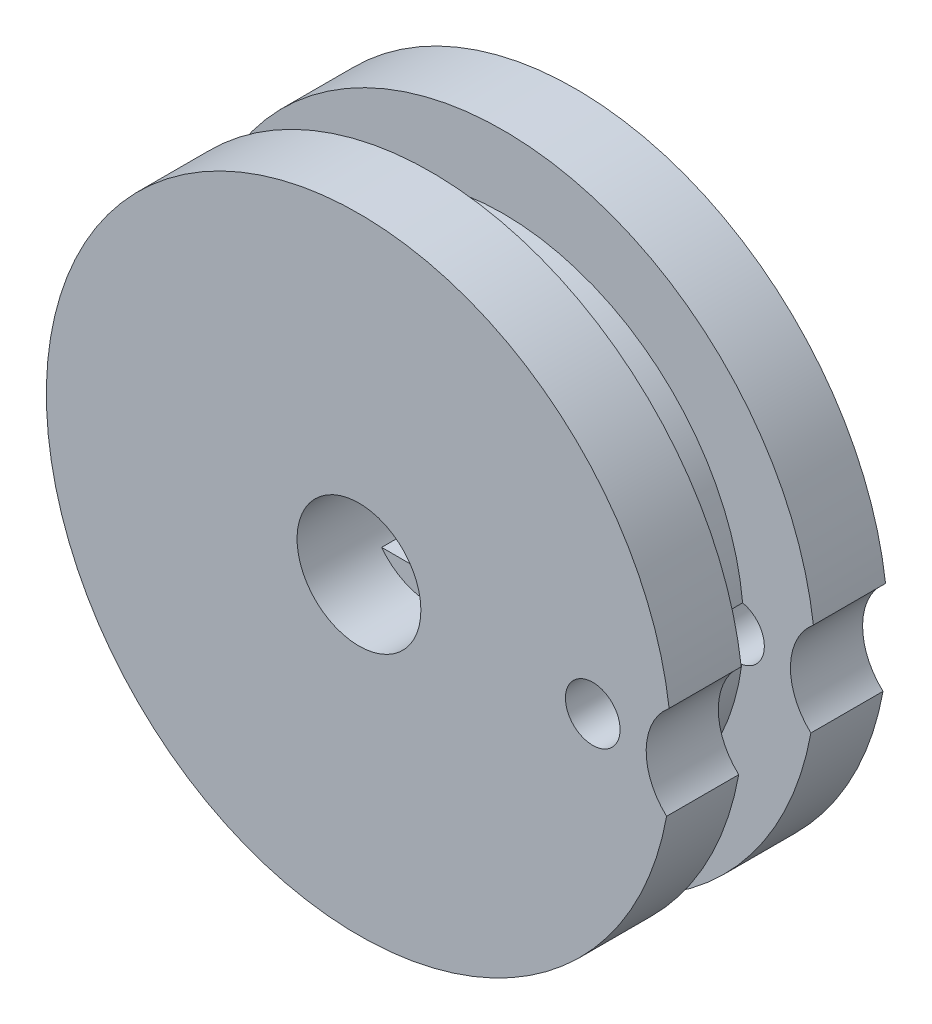
ISO-10303-21;
HEADER;
FILE_DESCRIPTION(('STEP AP214'),'2;1');
FILE_NAME('part.step','',(''),(''),'','','');
FILE_SCHEMA(('AUTOMOTIVE_DESIGN { 1 0 10303 214 1 1 1 1 }'));
ENDSEC;
DATA;
#1=APPLICATION_CONTEXT('core data for automotive mechanical design processes');
#2=APPLICATION_PROTOCOL_DEFINITION('international standard','automotive_design',2000,#1);
#3=PRODUCT_CONTEXT('',#1,'mechanical');
#4=PRODUCT('Part','Part','',(#3));
#5=PRODUCT_RELATED_PRODUCT_CATEGORY('part','',(#4));
#6=PRODUCT_DEFINITION_FORMATION('','',#4);
#7=PRODUCT_DEFINITION_CONTEXT('part definition',#1,'design');
#8=PRODUCT_DEFINITION('design','',#6,#7);
#9=PRODUCT_DEFINITION_SHAPE('','',#8);
#10=(LENGTH_UNIT() NAMED_UNIT(*) SI_UNIT(.MILLI.,.METRE.));
#11=(NAMED_UNIT(*) PLANE_ANGLE_UNIT() SI_UNIT($,.RADIAN.));
#12=(NAMED_UNIT(*) SI_UNIT($,.STERADIAN.) SOLID_ANGLE_UNIT());
#13=UNCERTAINTY_MEASURE_WITH_UNIT(LENGTH_MEASURE(1.E-05),#10,'distance_accuracy_value','');
#14=(GEOMETRIC_REPRESENTATION_CONTEXT(3) GLOBAL_UNCERTAINTY_ASSIGNED_CONTEXT((#13)) GLOBAL_UNIT_ASSIGNED_CONTEXT((#10,
#11,#12)) REPRESENTATION_CONTEXT('',''));
#15=CARTESIAN_POINT('',(0.,0.,0.));
#16=DIRECTION('',(0.,0.,1.));
#17=DIRECTION('',(1.,0.,0.));
#18=AXIS2_PLACEMENT_3D('',#15,#16,#17);
#19=CARTESIAN_POINT('',(0.,0.,0.));
#20=DIRECTION('',(0.,0.,1.));
#21=DIRECTION('',(1.,0.,0.));
#22=AXIS2_PLACEMENT_3D('',#19,#20,#21);
#23=PLANE('',#22);
#24=CARTESIAN_POINT('',(0.,0.,0.));
#25=DIRECTION('',(0.,0.,1.));
#26=DIRECTION('',(1.,0.,0.));
#27=AXIS2_PLACEMENT_3D('',#24,#25,#26);
#28=CIRCLE('',#27,13.);
#29=CARTESIAN_POINT('',(12.8976618667881,1.62797984324113,0.));
#30=VERTEX_POINT('',#29);
#31=CARTESIAN_POINT('',(12.7931561509895,-2.30979559623791,0.));
#32=VERTEX_POINT('',#31);
#33=EDGE_CURVE('E126',#30,#32,#28,.T.);
#34=ORIENTED_EDGE('',*,*,#33,.F.);
#35=CARTESIAN_POINT('',(14.5447372567907,-0.386006820725474,0.));
#36=DIRECTION('',(0.,0.,1.));
#37=DIRECTION('',(1.,0.,0.));
#38=AXIS2_PLACEMENT_3D('',#35,#36,#37);
#39=CIRCLE('',#38,2.60173012109007);
#40=EDGE_CURVE('E128',#30,#32,#39,.T.);
#41=ORIENTED_EDGE('',*,*,#40,.T.);
#42=EDGE_LOOP('',(#34,#41));
#43=FACE_BOUND('',#42,.T.);
#44=CARTESIAN_POINT('',(0.,0.,0.));
#45=DIRECTION('',(0.,0.,-1.));
#46=DIRECTION('',(-1.,0.,0.));
#47=AXIS2_PLACEMENT_3D('',#44,#45,#46);
#48=CIRCLE('',#47,10.);
#49=CARTESIAN_POINT('',(9.91846990033914,-1.27434486543731,0.));
#50=VERTEX_POINT('',#49);
#51=CARTESIAN_POINT('',(9.95411253835186,0.956892665781425,0.));
#52=VERTEX_POINT('',#51);
#53=EDGE_CURVE('E132',#50,#52,#48,.T.);
#54=ORIENTED_EDGE('',*,*,#53,.F.);
#55=CARTESIAN_POINT('',(9.72191381946582,-0.155301553604107,0.));
#56=DIRECTION('',(0.,0.,1.));
#57=DIRECTION('',(1.,0.,0.));
#58=AXIS2_PLACEMENT_3D('',#55,#56,#57);
#59=CIRCLE('',#58,1.13617438216451);
#60=EDGE_CURVE('E203',#50,#52,#59,.T.);
#61=ORIENTED_EDGE('',*,*,#60,.T.);
#62=EDGE_LOOP('',(#54,#61));
#63=FACE_BOUND('',#62,.T.);
#64=ADVANCED_FACE('F37',(#43,#63),#23,.F.);
#65=CARTESIAN_POINT('',(0.,0.,3.));
#66=DIRECTION('',(0.,0.,-1.));
#67=DIRECTION('',(-1.,0.,0.));
#68=AXIS2_PLACEMENT_3D('',#65,#66,#67);
#69=CYLINDRICAL_SURFACE('',#68,2.575);
#70=CARTESIAN_POINT('',(0.,0.,3.));
#71=DIRECTION('',(0.,0.,1.));
#72=DIRECTION('',(1.,0.,0.));
#73=AXIS2_PLACEMENT_3D('',#70,#71,#72);
#74=CIRCLE('',#73,2.575);
#75=CARTESIAN_POINT('',(2.575,0.,3.));
#76=VERTEX_POINT('',#75);
#77=EDGE_CURVE('E133',#76,#76,#74,.T.);
#78=ORIENTED_EDGE('',*,*,#77,.T.);
#79=EDGE_LOOP('',(#78));
#80=FACE_BOUND('',#79,.T.);
#81=CARTESIAN_POINT('',(0.,0.,0.));
#82=DIRECTION('',(0.,0.,1.));
#83=DIRECTION('',(1.,0.,0.));
#84=AXIS2_PLACEMENT_3D('',#81,#82,#83);
#85=CIRCLE('',#84,2.575);
#86=CARTESIAN_POINT('',(2.05624050149782,1.55,0.));
#87=VERTEX_POINT('',#86);
#88=CARTESIAN_POINT('',(-2.05624050149782,1.55,0.));
#89=VERTEX_POINT('',#88);
#90=EDGE_CURVE('E140',#87,#89,#85,.T.);
#91=ORIENTED_EDGE('',*,*,#90,.F.);
#92=DIRECTION('',(0.,0.,1.));
#93=VECTOR('',#92,1.);
#94=CARTESIAN_POINT('',(2.05624050149782,1.55,-3.));
#95=LINE('',#94,#93);
#96=CARTESIAN_POINT('',(2.05624050149782,1.55,-6.));
#97=VERTEX_POINT('',#96);
#98=EDGE_CURVE('E178',#97,#87,#95,.T.);
#99=ORIENTED_EDGE('',*,*,#98,.F.);
#100=CARTESIAN_POINT('',(0.,0.,-6.));
#101=DIRECTION('',(0.,0.,-1.));
#102=DIRECTION('',(-1.,0.,0.));
#103=AXIS2_PLACEMENT_3D('',#100,#101,#102);
#104=CIRCLE('',#103,2.575);
#105=CARTESIAN_POINT('',(2.05624050149782,-1.55,-6.));
#106=VERTEX_POINT('',#105);
#107=EDGE_CURVE('E164',#97,#106,#104,.T.);
#108=ORIENTED_EDGE('',*,*,#107,.T.);
#109=DIRECTION('',(0.,0.,1.));
#110=VECTOR('',#109,1.);
#111=CARTESIAN_POINT('',(2.05624050149782,-1.55,-3.));
#112=LINE('',#111,#110);
#113=CARTESIAN_POINT('',(2.05624050149782,-1.55,0.));
#114=VERTEX_POINT('',#113);
#115=EDGE_CURVE('E175',#106,#114,#112,.T.);
#116=ORIENTED_EDGE('',*,*,#115,.T.);
#117=CARTESIAN_POINT('',(-2.05624050149782,-1.55,0.));
#118=VERTEX_POINT('',#117);
#119=EDGE_CURVE('E142',#118,#114,#85,.T.);
#120=ORIENTED_EDGE('',*,*,#119,.F.);
#121=DIRECTION('',(0.,0.,1.));
#122=VECTOR('',#121,1.);
#123=CARTESIAN_POINT('',(-2.05624050149782,-1.55,-3.));
#124=LINE('',#123,#122);
#125=CARTESIAN_POINT('',(-2.05624050149782,-1.55,-6.));
#126=VERTEX_POINT('',#125);
#127=EDGE_CURVE('E172',#126,#118,#124,.T.);
#128=ORIENTED_EDGE('',*,*,#127,.F.);
#129=CARTESIAN_POINT('',(0.,0.,-6.));
#130=DIRECTION('',(0.,0.,-1.));
#131=DIRECTION('',(-1.,0.,0.));
#132=AXIS2_PLACEMENT_3D('',#129,#130,#131);
#133=CIRCLE('',#132,2.575);
#134=CARTESIAN_POINT('',(-2.05624050149782,1.55,-6.));
#135=VERTEX_POINT('',#134);
#136=EDGE_CURVE('E199',#126,#135,#133,.T.);
#137=ORIENTED_EDGE('',*,*,#136,.T.);
#138=DIRECTION('',(0.,0.,1.));
#139=VECTOR('',#138,1.);
#140=CARTESIAN_POINT('',(-2.05624050149782,1.55,-3.));
#141=LINE('',#140,#139);
#142=EDGE_CURVE('E181',#135,#89,#141,.T.);
#143=ORIENTED_EDGE('',*,*,#142,.T.);
#144=EDGE_LOOP('',(#91,#99,#108,#116,#120,#128,#137,#143));
#145=FACE_BOUND('',#144,.T.);
#146=ADVANCED_FACE('F39',(#80,#145),#69,.F.);
#147=CARTESIAN_POINT('',(0.,0.,3.));
#148=DIRECTION('',(0.,0.,-1.));
#149=DIRECTION('',(-1.,0.,0.));
#150=AXIS2_PLACEMENT_3D('',#147,#148,#149);
#151=CYLINDRICAL_SURFACE('',#150,13.);
#152=ORIENTED_EDGE('',*,*,#33,.T.);
#153=DIRECTION('',(0.,0.,1.));
#154=VECTOR('',#153,1.);
#155=CARTESIAN_POINT('',(12.7931561509895,-2.30979559623791,-4.));
#156=LINE('',#155,#154);
#157=CARTESIAN_POINT('',(12.7931561509895,-2.30979559623791,3.));
#158=VERTEX_POINT('',#157);
#159=EDGE_CURVE('E114',#32,#158,#156,.T.);
#160=ORIENTED_EDGE('',*,*,#159,.T.);
#161=CARTESIAN_POINT('',(0.,0.,3.));
#162=DIRECTION('',(0.,0.,1.));
#163=DIRECTION('',(1.,0.,0.));
#164=AXIS2_PLACEMENT_3D('',#161,#162,#163);
#165=CIRCLE('',#164,13.);
#166=CARTESIAN_POINT('',(12.8976618667881,1.62797984324113,3.));
#167=VERTEX_POINT('',#166);
#168=EDGE_CURVE('E124',#167,#158,#165,.T.);
#169=ORIENTED_EDGE('',*,*,#168,.F.);
#170=DIRECTION('',(0.,0.,1.));
#171=VECTOR('',#170,1.);
#172=CARTESIAN_POINT('',(12.8976618667881,1.62797984324113,-4.));
#173=LINE('',#172,#171);
#174=EDGE_CURVE('E52',#167,#30,#173,.F.);
#175=ORIENTED_EDGE('',*,*,#174,.T.);
#176=EDGE_LOOP('',(#152,#160,#169,#175));
#177=FACE_BOUND('',#176,.T.);
#178=ADVANCED_FACE('F123',(#177),#151,.T.);
#179=CARTESIAN_POINT('',(0.,0.,3.));
#180=DIRECTION('',(0.,0.,1.));
#181=DIRECTION('',(1.,0.,0.));
#182=AXIS2_PLACEMENT_3D('',#179,#180,#181);
#183=PLANE('',#182);
#184=CARTESIAN_POINT('',(14.5447372567907,-0.386006820725474,3.));
#185=DIRECTION('',(0.,0.,1.));
#186=DIRECTION('',(1.,0.,0.));
#187=AXIS2_PLACEMENT_3D('',#184,#185,#186);
#188=CIRCLE('',#187,2.60173012109007);
#189=EDGE_CURVE('E111',#167,#158,#188,.T.);
#190=ORIENTED_EDGE('',*,*,#189,.F.);
#191=ORIENTED_EDGE('',*,*,#168,.T.);
#192=EDGE_LOOP('',(#190,#191));
#193=FACE_BOUND('',#192,.T.);
#194=CARTESIAN_POINT('',(9.72191381946582,-0.155301553604107,3.));
#195=DIRECTION('',(0.,0.,1.));
#196=DIRECTION('',(1.,0.,0.));
#197=AXIS2_PLACEMENT_3D('',#194,#195,#196);
#198=CIRCLE('',#197,1.13617438216451);
#199=CARTESIAN_POINT('',(10.8580882016303,-0.155301553604107,3.));
#200=VERTEX_POINT('',#199);
#201=EDGE_CURVE('E127',#200,#200,#198,.T.);
#202=ORIENTED_EDGE('',*,*,#201,.F.);
#203=EDGE_LOOP('',(#202));
#204=FACE_BOUND('',#203,.T.);
#205=ORIENTED_EDGE('',*,*,#77,.F.);
#206=EDGE_LOOP('',(#205));
#207=FACE_BOUND('',#206,.T.);
#208=ADVANCED_FACE('F130',(#193,#204,#207),#183,.T.);
#209=CARTESIAN_POINT('',(0.,0.,0.));
#210=DIRECTION('',(0.,0.,-1.));
#211=DIRECTION('',(-1.,0.,0.));
#212=AXIS2_PLACEMENT_3D('',#209,#210,#211);
#213=PLANE('',#212);
#214=DIRECTION('',(1.,0.,0.));
#215=VECTOR('',#214,1.);
#216=CARTESIAN_POINT('',(-2.05624050149782,1.55,0.));
#217=LINE('',#216,#215);
#218=EDGE_CURVE('E161',#89,#87,#217,.T.);
#219=ORIENTED_EDGE('',*,*,#218,.T.);
#220=ORIENTED_EDGE('',*,*,#90,.T.);
#221=EDGE_LOOP('',(#219,#220));
#222=FACE_BOUND('',#221,.T.);
#223=ADVANCED_FACE('F255',(#222),#213,.F.);
#224=DIRECTION('',(-1.,0.,0.));
#225=VECTOR('',#224,1.);
#226=CARTESIAN_POINT('',(-2.05624050149782,-1.55,0.));
#227=LINE('',#226,#225);
#228=EDGE_CURVE('E169',#114,#118,#227,.T.);
#229=ORIENTED_EDGE('',*,*,#228,.T.);
#230=ORIENTED_EDGE('',*,*,#119,.T.);
#231=EDGE_LOOP('',(#229,#230));
#232=FACE_BOUND('',#231,.T.);
#233=ADVANCED_FACE('F189',(#232),#213,.F.);
#234=CARTESIAN_POINT('',(0.,0.,-3.));
#235=DIRECTION('',(0.,0.,1.));
#236=DIRECTION('',(1.,0.,0.));
#237=AXIS2_PLACEMENT_3D('',#234,#235,#236);
#238=CYLINDRICAL_SURFACE('',#237,10.);
#239=ORIENTED_EDGE('',*,*,#53,.T.);
#240=DIRECTION('',(0.,0.,1.));
#241=VECTOR('',#240,1.);
#242=CARTESIAN_POINT('',(9.95411253835186,0.956892665781425,-4.));
#243=LINE('',#242,#241);
#244=CARTESIAN_POINT('',(9.95411253835186,0.956892665781428,-3.));
#245=VERTEX_POINT('',#244);
#246=EDGE_CURVE('E213',#52,#245,#243,.F.);
#247=ORIENTED_EDGE('',*,*,#246,.T.);
#248=CARTESIAN_POINT('',(0.,0.,-3.));
#249=DIRECTION('',(0.,0.,-1.));
#250=DIRECTION('',(-1.,0.,0.));
#251=AXIS2_PLACEMENT_3D('',#248,#249,#250);
#252=CIRCLE('',#251,10.);
#253=CARTESIAN_POINT('',(9.91846990033914,-1.27434486543732,-3.));
#254=VERTEX_POINT('',#253);
#255=EDGE_CURVE('E184',#254,#245,#252,.T.);
#256=ORIENTED_EDGE('',*,*,#255,.F.);
#257=DIRECTION('',(0.,0.,1.));
#258=VECTOR('',#257,1.);
#259=CARTESIAN_POINT('',(9.91846990033914,-1.27434486543731,-4.));
#260=LINE('',#259,#258);
#261=EDGE_CURVE('E216',#254,#50,#260,.T.);
#262=ORIENTED_EDGE('',*,*,#261,.T.);
#263=EDGE_LOOP('',(#239,#247,#256,#262));
#264=FACE_BOUND('',#263,.T.);
#265=ADVANCED_FACE('F240',(#264),#238,.T.);
#266=CARTESIAN_POINT('',(-2.05624050149782,1.55,-3.));
#267=DIRECTION('',(0.,-1.,0.));
#268=DIRECTION('',(0.,0.,-1.));
#269=AXIS2_PLACEMENT_3D('',#266,#267,#268);
#270=PLANE('',#269);
#271=ORIENTED_EDGE('',*,*,#218,.F.);
#272=ORIENTED_EDGE('',*,*,#142,.F.);
#273=DIRECTION('',(1.,0.,0.));
#274=VECTOR('',#273,1.);
#275=CARTESIAN_POINT('',(-2.05624050149782,1.55,-6.));
#276=LINE('',#275,#274);
#277=EDGE_CURVE('E202',#135,#97,#276,.T.);
#278=ORIENTED_EDGE('',*,*,#277,.T.);
#279=ORIENTED_EDGE('',*,*,#98,.T.);
#280=EDGE_LOOP('',(#271,#272,#278,#279));
#281=FACE_BOUND('',#280,.T.);
#282=ADVANCED_FACE('F265',(#281),#270,.T.);
#283=CARTESIAN_POINT('',(-2.05624050149782,-1.55,-3.));
#284=DIRECTION('',(0.,1.,0.));
#285=DIRECTION('',(0.,0.,1.));
#286=AXIS2_PLACEMENT_3D('',#283,#284,#285);
#287=PLANE('',#286);
#288=ORIENTED_EDGE('',*,*,#228,.F.);
#289=ORIENTED_EDGE('',*,*,#115,.F.);
#290=DIRECTION('',(-1.,0.,0.));
#291=VECTOR('',#290,1.);
#292=CARTESIAN_POINT('',(-2.05624050149782,-1.55,-6.));
#293=LINE('',#292,#291);
#294=EDGE_CURVE('E159',#106,#126,#293,.T.);
#295=ORIENTED_EDGE('',*,*,#294,.T.);
#296=ORIENTED_EDGE('',*,*,#127,.T.);
#297=EDGE_LOOP('',(#288,#289,#295,#296));
#298=FACE_BOUND('',#297,.T.);
#299=ADVANCED_FACE('F196',(#298),#287,.T.);
#300=CARTESIAN_POINT('',(0.,0.,-3.));
#301=DIRECTION('',(0.,0.,-1.));
#302=DIRECTION('',(-1.,0.,0.));
#303=AXIS2_PLACEMENT_3D('',#300,#301,#302);
#304=PLANE('',#303);
#305=CARTESIAN_POINT('',(0.,0.,-3.));
#306=DIRECTION('',(0.,0.,-1.));
#307=DIRECTION('',(-1.,0.,0.));
#308=AXIS2_PLACEMENT_3D('',#305,#306,#307);
#309=CIRCLE('',#308,13.);
#310=CARTESIAN_POINT('',(12.7931561509895,-2.30979559623791,-3.));
#311=VERTEX_POINT('',#310);
#312=CARTESIAN_POINT('',(12.8976618667881,1.62797984324113,-3.));
#313=VERTEX_POINT('',#312);
#314=EDGE_CURVE('E152',#311,#313,#309,.T.);
#315=ORIENTED_EDGE('',*,*,#314,.F.);
#316=CARTESIAN_POINT('',(14.5447372567907,-0.386006820725474,-3.));
#317=DIRECTION('',(0.,0.,-1.));
#318=DIRECTION('',(-1.,0.,0.));
#319=AXIS2_PLACEMENT_3D('',#316,#317,#318);
#320=CIRCLE('',#319,2.60173012109007);
#321=EDGE_CURVE('E60',#311,#313,#320,.T.);
#322=ORIENTED_EDGE('',*,*,#321,.T.);
#323=EDGE_LOOP('',(#315,#322));
#324=FACE_BOUND('',#323,.T.);
#325=ORIENTED_EDGE('',*,*,#255,.T.);
#326=CARTESIAN_POINT('',(9.72191381946582,-0.155301553604107,-3.));
#327=DIRECTION('',(0.,0.,-1.));
#328=DIRECTION('',(-1.,0.,0.));
#329=AXIS2_PLACEMENT_3D('',#326,#327,#328);
#330=CIRCLE('',#329,1.13617438216451);
#331=EDGE_CURVE('E146',#245,#254,#330,.T.);
#332=ORIENTED_EDGE('',*,*,#331,.T.);
#333=EDGE_LOOP('',(#325,#332));
#334=FACE_BOUND('',#333,.T.);
#335=ADVANCED_FACE('F157',(#324,#334),#304,.F.);
#336=CARTESIAN_POINT('',(0.,0.,-6.));
#337=DIRECTION('',(0.,0.,-1.));
#338=DIRECTION('',(-1.,0.,0.));
#339=AXIS2_PLACEMENT_3D('',#336,#337,#338);
#340=PLANE('',#339);
#341=CARTESIAN_POINT('',(14.5447372567907,-0.386006820725474,-6.));
#342=DIRECTION('',(0.,0.,-1.));
#343=DIRECTION('',(-1.,0.,0.));
#344=AXIS2_PLACEMENT_3D('',#341,#342,#343);
#345=CIRCLE('',#344,2.60173012109007);
#346=CARTESIAN_POINT('',(12.7931561509895,-2.30979559623791,-6.));
#347=VERTEX_POINT('',#346);
#348=CARTESIAN_POINT('',(12.8976618667881,1.62797984324113,-6.));
#349=VERTEX_POINT('',#348);
#350=EDGE_CURVE('E119',#347,#349,#345,.T.);
#351=ORIENTED_EDGE('',*,*,#350,.F.);
#352=CARTESIAN_POINT('',(0.,0.,-6.));
#353=DIRECTION('',(0.,0.,-1.));
#354=DIRECTION('',(-1.,0.,0.));
#355=AXIS2_PLACEMENT_3D('',#352,#353,#354);
#356=CIRCLE('',#355,13.);
#357=EDGE_CURVE('E154',#347,#349,#356,.T.);
#358=ORIENTED_EDGE('',*,*,#357,.T.);
#359=EDGE_LOOP('',(#351,#358));
#360=FACE_BOUND('',#359,.T.);
#361=CARTESIAN_POINT('',(9.72191381946582,-0.155301553604107,-6.));
#362=DIRECTION('',(0.,0.,-1.));
#363=DIRECTION('',(-1.,0.,0.));
#364=AXIS2_PLACEMENT_3D('',#361,#362,#363);
#365=CIRCLE('',#364,1.13617438216451);
#366=CARTESIAN_POINT('',(8.58573943730131,-0.155301553604107,-6.));
#367=VERTEX_POINT('',#366);
#368=EDGE_CURVE('E144',#367,#367,#365,.T.);
#369=ORIENTED_EDGE('',*,*,#368,.F.);
#370=EDGE_LOOP('',(#369));
#371=FACE_BOUND('',#370,.T.);
#372=ORIENTED_EDGE('',*,*,#277,.F.);
#373=ORIENTED_EDGE('',*,*,#136,.F.);
#374=ORIENTED_EDGE('',*,*,#294,.F.);
#375=ORIENTED_EDGE('',*,*,#107,.F.);
#376=EDGE_LOOP('',(#372,#373,#374,#375));
#377=FACE_BOUND('',#376,.T.);
#378=ADVANCED_FACE('F206',(#360,#371,#377),#340,.T.);
#379=CARTESIAN_POINT('',(0.,0.,-6.));
#380=DIRECTION('',(0.,0.,1.));
#381=DIRECTION('',(1.,0.,0.));
#382=AXIS2_PLACEMENT_3D('',#379,#380,#381);
#383=CYLINDRICAL_SURFACE('',#382,13.);
#384=ORIENTED_EDGE('',*,*,#314,.T.);
#385=DIRECTION('',(0.,0.,1.));
#386=VECTOR('',#385,1.);
#387=CARTESIAN_POINT('',(12.8976618667881,1.62797984324113,-4.));
#388=LINE('',#387,#386);
#389=EDGE_CURVE('E11',#313,#349,#388,.F.);
#390=ORIENTED_EDGE('',*,*,#389,.T.);
#391=ORIENTED_EDGE('',*,*,#357,.F.);
#392=DIRECTION('',(0.,0.,1.));
#393=VECTOR('',#392,1.);
#394=CARTESIAN_POINT('',(12.7931561509895,-2.30979559623791,-4.));
#395=LINE('',#394,#393);
#396=EDGE_CURVE('E45',#347,#311,#395,.T.);
#397=ORIENTED_EDGE('',*,*,#396,.T.);
#398=EDGE_LOOP('',(#384,#390,#391,#397));
#399=FACE_BOUND('',#398,.T.);
#400=ADVANCED_FACE('F151',(#399),#383,.T.);
#401=CARTESIAN_POINT('',(9.72191381946582,-0.155301553604107,-11.));
#402=DIRECTION('',(0.,0.,1.));
#403=DIRECTION('',(1.,0.,0.));
#404=AXIS2_PLACEMENT_3D('',#401,#402,#403);
#405=CYLINDRICAL_SURFACE('',#404,1.13617438216451);
#406=ORIENTED_EDGE('',*,*,#368,.T.);
#407=EDGE_LOOP('',(#406));
#408=FACE_BOUND('',#407,.T.);
#409=ORIENTED_EDGE('',*,*,#201,.T.);
#410=EDGE_LOOP('',(#409));
#411=FACE_BOUND('',#410,.T.);
#412=ORIENTED_EDGE('',*,*,#261,.F.);
#413=ORIENTED_EDGE('',*,*,#331,.F.);
#414=ORIENTED_EDGE('',*,*,#246,.F.);
#415=ORIENTED_EDGE('',*,*,#60,.F.);
#416=EDGE_LOOP('',(#412,#413,#414,#415));
#417=FACE_BOUND('',#416,.T.);
#418=ADVANCED_FACE('F232',(#408,#411,#417),#405,.F.);
#419=CARTESIAN_POINT('',(14.5447372567907,-0.386006820725474,-11.));
#420=DIRECTION('',(0.,0.,1.));
#421=DIRECTION('',(1.,0.,0.));
#422=AXIS2_PLACEMENT_3D('',#419,#420,#421);
#423=CYLINDRICAL_SURFACE('',#422,2.60173012109007);
#424=ORIENTED_EDGE('',*,*,#321,.F.);
#425=ORIENTED_EDGE('',*,*,#396,.F.);
#426=ORIENTED_EDGE('',*,*,#350,.T.);
#427=ORIENTED_EDGE('',*,*,#389,.F.);
#428=EDGE_LOOP('',(#424,#425,#426,#427));
#429=FACE_BOUND('',#428,.T.);
#430=ADVANCED_FACE('F225',(#429),#423,.F.);
#431=ORIENTED_EDGE('',*,*,#40,.F.);
#432=ORIENTED_EDGE('',*,*,#174,.F.);
#433=ORIENTED_EDGE('',*,*,#189,.T.);
#434=ORIENTED_EDGE('',*,*,#159,.F.);
#435=EDGE_LOOP('',(#431,#432,#433,#434));
#436=FACE_BOUND('',#435,.T.);
#437=ADVANCED_FACE('F113',(#436),#423,.F.);
#438=CLOSED_SHELL('',(#64,#146,#178,#208,#223,#233,#265,#282,#299,#335,#378,#400,#418,#430,#437));
#439=MANIFOLD_SOLID_BREP('B2',#438);
#440=ADVANCED_BREP_SHAPE_REPRESENTATION('',(#18,#439),#14);
#441=SHAPE_DEFINITION_REPRESENTATION(#9,#440);
ENDSEC;
END-ISO-10303-21;
